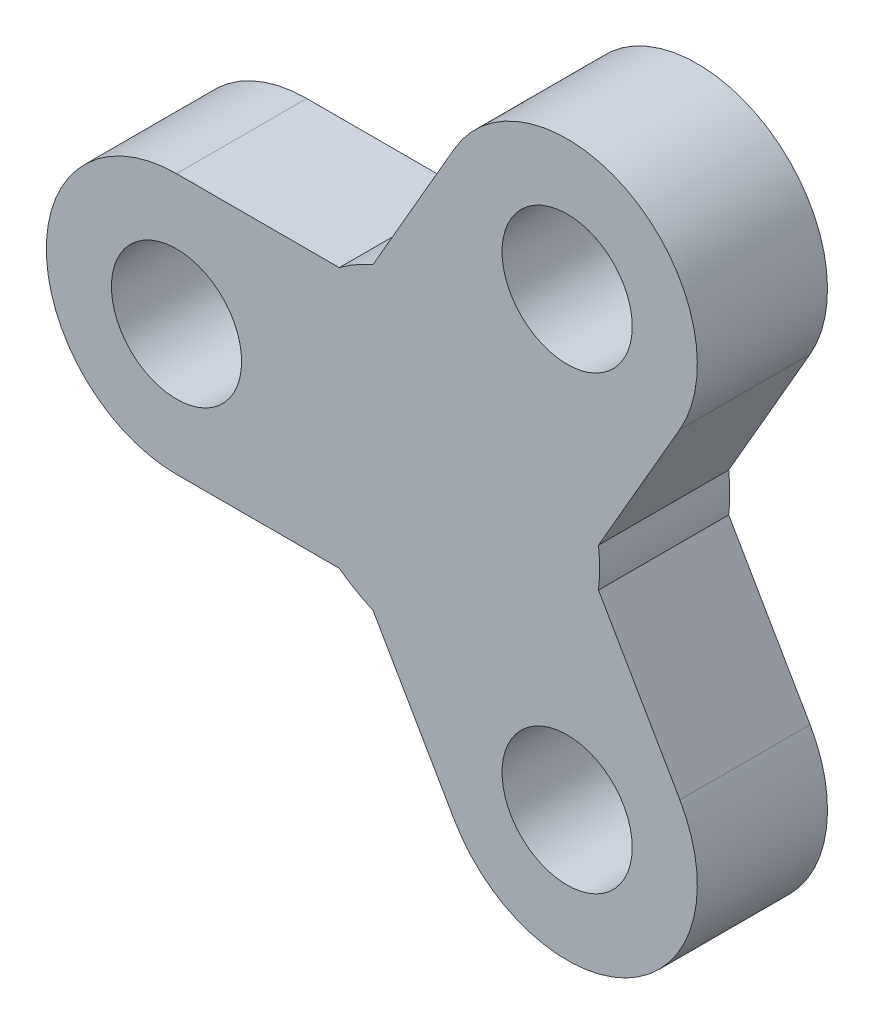
ISO-10303-21;
HEADER;
FILE_DESCRIPTION(('STEP AP214'),'2;1');
FILE_NAME('part.step','',(''),(''),'','','');
FILE_SCHEMA(('AUTOMOTIVE_DESIGN { 1 0 10303 214 1 1 1 1 }'));
ENDSEC;
DATA;
#1=APPLICATION_CONTEXT('core data for automotive mechanical design processes');
#2=APPLICATION_PROTOCOL_DEFINITION('international standard','automotive_design',2000,#1);
#3=PRODUCT_CONTEXT('',#1,'mechanical');
#4=PRODUCT('Part','Part','',(#3));
#5=PRODUCT_RELATED_PRODUCT_CATEGORY('part','',(#4));
#6=PRODUCT_DEFINITION_FORMATION('','',#4);
#7=PRODUCT_DEFINITION_CONTEXT('part definition',#1,'design');
#8=PRODUCT_DEFINITION('design','',#6,#7);
#9=PRODUCT_DEFINITION_SHAPE('','',#8);
#10=(LENGTH_UNIT() NAMED_UNIT(*) SI_UNIT(.MILLI.,.METRE.));
#11=(NAMED_UNIT(*) PLANE_ANGLE_UNIT() SI_UNIT($,.RADIAN.));
#12=(NAMED_UNIT(*) SI_UNIT($,.STERADIAN.) SOLID_ANGLE_UNIT());
#13=UNCERTAINTY_MEASURE_WITH_UNIT(LENGTH_MEASURE(1.E-05),#10,'distance_accuracy_value','');
#14=(GEOMETRIC_REPRESENTATION_CONTEXT(3) GLOBAL_UNCERTAINTY_ASSIGNED_CONTEXT((#13)) GLOBAL_UNIT_ASSIGNED_CONTEXT((#10,
#11,#12)) REPRESENTATION_CONTEXT('',''));
#15=CARTESIAN_POINT('',(0.,0.,0.));
#16=DIRECTION('',(0.,0.,1.));
#17=DIRECTION('',(1.,0.,0.));
#18=AXIS2_PLACEMENT_3D('',#15,#16,#17);
#19=CARTESIAN_POINT('',(-20.,0.,10.));
#20=DIRECTION('',(0.,0.,1.));
#21=DIRECTION('',(1.,0.,0.));
#22=AXIS2_PLACEMENT_3D('',#19,#20,#21);
#23=PLANE('',#22);
#24=CARTESIAN_POINT('',(10.,17.3205080756888,10.));
#25=DIRECTION('',(0.,0.,1.));
#26=DIRECTION('',(1.,0.,0.));
#27=AXIS2_PLACEMENT_3D('',#24,#25,#26);
#28=CIRCLE('',#27,5.);
#29=CARTESIAN_POINT('',(15.,17.3205080756888,10.));
#30=VERTEX_POINT('',#29);
#31=EDGE_CURVE('E289',#30,#30,#28,.T.);
#32=ORIENTED_EDGE('',*,*,#31,.F.);
#33=EDGE_LOOP('',(#32));
#34=FACE_BOUND('',#33,.T.);
#35=CARTESIAN_POINT('',(-20.,0.,10.));
#36=DIRECTION('',(0.,0.,1.));
#37=DIRECTION('',(1.,0.,0.));
#38=AXIS2_PLACEMENT_3D('',#35,#36,#37);
#39=CIRCLE('',#38,10.);
#40=CARTESIAN_POINT('',(-20.,10.,10.));
#41=VERTEX_POINT('',#40);
#42=CARTESIAN_POINT('',(-20.,-10.,10.));
#43=VERTEX_POINT('',#42);
#44=EDGE_CURVE('E180',#41,#43,#39,.T.);
#45=ORIENTED_EDGE('',*,*,#44,.T.);
#46=DIRECTION('',(1.,0.,0.));
#47=VECTOR('',#46,1.);
#48=CARTESIAN_POINT('',(-20.,-10.,10.));
#49=LINE('',#48,#47);
#50=CARTESIAN_POINT('',(-7.5,-10.,10.));
#51=VERTEX_POINT('',#50);
#52=EDGE_CURVE('E108',#43,#51,#49,.T.);
#53=ORIENTED_EDGE('',*,*,#52,.T.);
#54=CARTESIAN_POINT('',(2.63677968348475E-13,4.54497550705923E-13,10.));
#55=DIRECTION('',(0.,0.,1.));
#56=DIRECTION('',(1.,0.,0.));
#57=AXIS2_PLACEMENT_3D('',#54,#55,#56);
#58=CIRCLE('',#57,12.5000000000005);
#59=CARTESIAN_POINT('',(-4.91025403784438,-11.4951905283833,10.));
#60=VERTEX_POINT('',#59);
#61=EDGE_CURVE('E207',#51,#60,#58,.T.);
#62=ORIENTED_EDGE('',*,*,#61,.T.);
#63=DIRECTION('',(0.500000000000001,-0.866025403784438,0.));
#64=VECTOR('',#63,1.);
#65=CARTESIAN_POINT('',(1.33974596215562,-22.3205080756888,10.));
#66=LINE('',#65,#64);
#67=CARTESIAN_POINT('',(1.33974596215561,-22.3205080756888,10.));
#68=VERTEX_POINT('',#67);
#69=EDGE_CURVE('E226',#60,#68,#66,.T.);
#70=ORIENTED_EDGE('',*,*,#69,.T.);
#71=CARTESIAN_POINT('',(9.99999999999999,-17.3205080756888,10.));
#72=DIRECTION('',(0.,0.,1.));
#73=DIRECTION('',(1.,0.,0.));
#74=AXIS2_PLACEMENT_3D('',#71,#72,#73);
#75=CIRCLE('',#74,10.);
#76=CARTESIAN_POINT('',(18.6602540378444,-12.3205080756888,10.));
#77=VERTEX_POINT('',#76);
#78=EDGE_CURVE('E223',#68,#77,#75,.T.);
#79=ORIENTED_EDGE('',*,*,#78,.T.);
#80=DIRECTION('',(-0.500000000000001,0.866025403784438,0.));
#81=VECTOR('',#80,1.);
#82=CARTESIAN_POINT('',(18.6602540378444,-12.3205080756888,10.));
#83=LINE('',#82,#81);
#84=CARTESIAN_POINT('',(12.4102540378444,-1.49519052838328,10.));
#85=VERTEX_POINT('',#84);
#86=EDGE_CURVE('E225',#77,#85,#83,.T.);
#87=ORIENTED_EDGE('',*,*,#86,.T.);
#88=CARTESIAN_POINT('',(-1.58998502731988E-06,0.,10.));
#89=DIRECTION('',(0.,0.,1.));
#90=DIRECTION('',(-1.,0.,0.));
#91=AXIS2_PLACEMENT_3D('',#88,#89,#90);
#92=CIRCLE('',#91,12.5000015785694);
#93=CARTESIAN_POINT('',(12.4102540378444,1.49519052838329,10.));
#94=VERTEX_POINT('',#93);
#95=EDGE_CURVE('E228',#85,#94,#92,.T.);
#96=ORIENTED_EDGE('',*,*,#95,.T.);
#97=DIRECTION('',(0.5,0.866025403784439,0.));
#98=VECTOR('',#97,1.);
#99=CARTESIAN_POINT('',(18.6602540378444,12.3205080756888,10.));
#100=LINE('',#99,#98);
#101=CARTESIAN_POINT('',(18.6602540378444,12.3205080756888,10.));
#102=VERTEX_POINT('',#101);
#103=EDGE_CURVE('E234',#94,#102,#100,.T.);
#104=ORIENTED_EDGE('',*,*,#103,.T.);
#105=CARTESIAN_POINT('',(10.,17.3205080756888,10.));
#106=DIRECTION('',(0.,0.,1.));
#107=DIRECTION('',(1.,0.,0.));
#108=AXIS2_PLACEMENT_3D('',#105,#106,#107);
#109=CIRCLE('',#108,10.);
#110=CARTESIAN_POINT('',(1.33974596215561,22.3205080756888,10.));
#111=VERTEX_POINT('',#110);
#112=EDGE_CURVE('E139',#102,#111,#109,.T.);
#113=ORIENTED_EDGE('',*,*,#112,.T.);
#114=DIRECTION('',(-0.5,-0.866025403784439,0.));
#115=VECTOR('',#114,1.);
#116=CARTESIAN_POINT('',(1.33974596215561,22.3205080756888,10.));
#117=LINE('',#116,#115);
#118=CARTESIAN_POINT('',(-4.91025403784439,11.4951905283833,10.));
#119=VERTEX_POINT('',#118);
#120=EDGE_CURVE('E133',#111,#119,#117,.T.);
#121=ORIENTED_EDGE('',*,*,#120,.T.);
#122=CARTESIAN_POINT('',(0.,0.,10.));
#123=DIRECTION('',(0.,0.,1.));
#124=DIRECTION('',(-1.,0.,0.));
#125=AXIS2_PLACEMENT_3D('',#122,#123,#124);
#126=CIRCLE('',#125,12.5);
#127=CARTESIAN_POINT('',(-7.5,10.,10.));
#128=VERTEX_POINT('',#127);
#129=EDGE_CURVE('E137',#119,#128,#126,.T.);
#130=ORIENTED_EDGE('',*,*,#129,.T.);
#131=DIRECTION('',(-1.,0.,0.));
#132=VECTOR('',#131,1.);
#133=CARTESIAN_POINT('',(-20.,10.,10.));
#134=LINE('',#133,#132);
#135=EDGE_CURVE('E53',#128,#41,#134,.T.);
#136=ORIENTED_EDGE('',*,*,#135,.T.);
#137=EDGE_LOOP('',(#45,#53,#62,#70,#79,#87,#96,#104,#113,#121,#130,#136));
#138=FACE_BOUND('',#137,.T.);
#139=CARTESIAN_POINT('',(-20.,0.,10.));
#140=DIRECTION('',(0.,0.,1.));
#141=DIRECTION('',(1.,0.,0.));
#142=AXIS2_PLACEMENT_3D('',#139,#140,#141);
#143=CIRCLE('',#142,5.);
#144=CARTESIAN_POINT('',(-15.,0.,10.));
#145=VERTEX_POINT('',#144);
#146=EDGE_CURVE('E161',#145,#145,#143,.T.);
#147=ORIENTED_EDGE('',*,*,#146,.F.);
#148=EDGE_LOOP('',(#147));
#149=FACE_BOUND('',#148,.T.);
#150=CARTESIAN_POINT('',(9.99999999999999,-17.3205080756888,10.));
#151=DIRECTION('',(0.,0.,1.));
#152=DIRECTION('',(1.,0.,0.));
#153=AXIS2_PLACEMENT_3D('',#150,#151,#152);
#154=CIRCLE('',#153,5.);
#155=CARTESIAN_POINT('',(15.,-17.3205080756888,10.));
#156=VERTEX_POINT('',#155);
#157=EDGE_CURVE('E280',#156,#156,#154,.T.);
#158=ORIENTED_EDGE('',*,*,#157,.F.);
#159=EDGE_LOOP('',(#158));
#160=FACE_BOUND('',#159,.T.);
#161=ADVANCED_FACE('F36',(#34,#138,#149,#160),#23,.T.);
#162=CARTESIAN_POINT('',(-20.,0.,0.));
#163=DIRECTION('',(0.,0.,1.));
#164=DIRECTION('',(1.,0.,0.));
#165=AXIS2_PLACEMENT_3D('',#162,#163,#164);
#166=PLANE('',#165);
#167=CARTESIAN_POINT('',(-20.,0.,0.));
#168=DIRECTION('',(0.,0.,1.));
#169=DIRECTION('',(1.,0.,0.));
#170=AXIS2_PLACEMENT_3D('',#167,#168,#169);
#171=CIRCLE('',#170,10.);
#172=CARTESIAN_POINT('',(-20.,10.,0.));
#173=VERTEX_POINT('',#172);
#174=CARTESIAN_POINT('',(-20.,-10.,0.));
#175=VERTEX_POINT('',#174);
#176=EDGE_CURVE('E157',#173,#175,#171,.T.);
#177=ORIENTED_EDGE('',*,*,#176,.F.);
#178=DIRECTION('',(-1.,0.,0.));
#179=VECTOR('',#178,1.);
#180=CARTESIAN_POINT('',(-20.,10.,0.));
#181=LINE('',#180,#179);
#182=CARTESIAN_POINT('',(-7.5,10.,0.));
#183=VERTEX_POINT('',#182);
#184=EDGE_CURVE('E100',#183,#173,#181,.T.);
#185=ORIENTED_EDGE('',*,*,#184,.F.);
#186=CARTESIAN_POINT('',(0.,0.,0.));
#187=DIRECTION('',(0.,0.,1.));
#188=DIRECTION('',(-1.,0.,0.));
#189=AXIS2_PLACEMENT_3D('',#186,#187,#188);
#190=CIRCLE('',#189,12.5);
#191=CARTESIAN_POINT('',(-4.91025403784439,11.4951905283833,0.));
#192=VERTEX_POINT('',#191);
#193=EDGE_CURVE('E94',#192,#183,#190,.T.);
#194=ORIENTED_EDGE('',*,*,#193,.F.);
#195=DIRECTION('',(-0.5,-0.866025403784439,0.));
#196=VECTOR('',#195,1.);
#197=CARTESIAN_POINT('',(1.33974596215561,22.3205080756888,0.));
#198=LINE('',#197,#196);
#199=CARTESIAN_POINT('',(1.33974596215561,22.3205080756888,0.));
#200=VERTEX_POINT('',#199);
#201=EDGE_CURVE('E147',#200,#192,#198,.T.);
#202=ORIENTED_EDGE('',*,*,#201,.F.);
#203=CARTESIAN_POINT('',(10.,17.3205080756888,0.));
#204=DIRECTION('',(0.,0.,1.));
#205=DIRECTION('',(1.,0.,0.));
#206=AXIS2_PLACEMENT_3D('',#203,#204,#205);
#207=CIRCLE('',#206,10.);
#208=CARTESIAN_POINT('',(18.6602540378444,12.3205080756888,0.));
#209=VERTEX_POINT('',#208);
#210=EDGE_CURVE('E175',#209,#200,#207,.T.);
#211=ORIENTED_EDGE('',*,*,#210,.F.);
#212=DIRECTION('',(0.5,0.866025403784439,0.));
#213=VECTOR('',#212,1.);
#214=CARTESIAN_POINT('',(18.6602540378444,12.3205080756888,0.));
#215=LINE('',#214,#213);
#216=CARTESIAN_POINT('',(12.4102540378444,1.49519052838329,0.));
#217=VERTEX_POINT('',#216);
#218=EDGE_CURVE('E173',#217,#209,#215,.T.);
#219=ORIENTED_EDGE('',*,*,#218,.F.);
#220=CARTESIAN_POINT('',(-1.58998502731988E-06,0.,0.));
#221=DIRECTION('',(0.,0.,1.));
#222=DIRECTION('',(-1.,0.,0.));
#223=AXIS2_PLACEMENT_3D('',#220,#221,#222);
#224=CIRCLE('',#223,12.5000015785694);
#225=CARTESIAN_POINT('',(12.4102540378444,-1.49519052838328,0.));
#226=VERTEX_POINT('',#225);
#227=EDGE_CURVE('E171',#226,#217,#224,.T.);
#228=ORIENTED_EDGE('',*,*,#227,.F.);
#229=DIRECTION('',(-0.500000000000001,0.866025403784438,0.));
#230=VECTOR('',#229,1.);
#231=CARTESIAN_POINT('',(18.6602540378444,-12.3205080756888,0.));
#232=LINE('',#231,#230);
#233=CARTESIAN_POINT('',(18.6602540378444,-12.3205080756888,0.));
#234=VERTEX_POINT('',#233);
#235=EDGE_CURVE('E169',#234,#226,#232,.T.);
#236=ORIENTED_EDGE('',*,*,#235,.F.);
#237=CARTESIAN_POINT('',(9.99999999999999,-17.3205080756888,0.));
#238=DIRECTION('',(0.,0.,1.));
#239=DIRECTION('',(1.,0.,0.));
#240=AXIS2_PLACEMENT_3D('',#237,#238,#239);
#241=CIRCLE('',#240,10.);
#242=CARTESIAN_POINT('',(1.33974596215561,-22.3205080756888,0.));
#243=VERTEX_POINT('',#242);
#244=EDGE_CURVE('E167',#243,#234,#241,.T.);
#245=ORIENTED_EDGE('',*,*,#244,.F.);
#246=DIRECTION('',(0.500000000000001,-0.866025403784438,0.));
#247=VECTOR('',#246,1.);
#248=CARTESIAN_POINT('',(1.33974596215562,-22.3205080756888,0.));
#249=LINE('',#248,#247);
#250=CARTESIAN_POINT('',(-4.91025403784438,-11.4951905283833,0.));
#251=VERTEX_POINT('',#250);
#252=EDGE_CURVE('E165',#251,#243,#249,.T.);
#253=ORIENTED_EDGE('',*,*,#252,.F.);
#254=CARTESIAN_POINT('',(2.63677968348475E-13,4.54497550705923E-13,0.));
#255=DIRECTION('',(0.,0.,1.));
#256=DIRECTION('',(1.,0.,0.));
#257=AXIS2_PLACEMENT_3D('',#254,#255,#256);
#258=CIRCLE('',#257,12.5000000000005);
#259=CARTESIAN_POINT('',(-7.5,-10.,0.));
#260=VERTEX_POINT('',#259);
#261=EDGE_CURVE('E163',#260,#251,#258,.T.);
#262=ORIENTED_EDGE('',*,*,#261,.F.);
#263=DIRECTION('',(1.,0.,0.));
#264=VECTOR('',#263,1.);
#265=CARTESIAN_POINT('',(-20.,-10.,0.));
#266=LINE('',#265,#264);
#267=EDGE_CURVE('E160',#175,#260,#266,.T.);
#268=ORIENTED_EDGE('',*,*,#267,.F.);
#269=EDGE_LOOP('',(#177,#185,#194,#202,#211,#219,#228,#236,#245,#253,#262,#268));
#270=FACE_BOUND('',#269,.T.);
#271=CARTESIAN_POINT('',(-20.,0.,0.));
#272=DIRECTION('',(0.,0.,1.));
#273=DIRECTION('',(1.,0.,0.));
#274=AXIS2_PLACEMENT_3D('',#271,#272,#273);
#275=CIRCLE('',#274,5.);
#276=CARTESIAN_POINT('',(-15.,0.,0.));
#277=VERTEX_POINT('',#276);
#278=EDGE_CURVE('E292',#277,#277,#275,.T.);
#279=ORIENTED_EDGE('',*,*,#278,.T.);
#280=EDGE_LOOP('',(#279));
#281=FACE_BOUND('',#280,.T.);
#282=CARTESIAN_POINT('',(10.,17.3205080756888,0.));
#283=DIRECTION('',(0.,0.,1.));
#284=DIRECTION('',(1.,0.,0.));
#285=AXIS2_PLACEMENT_3D('',#282,#283,#284);
#286=CIRCLE('',#285,5.);
#287=CARTESIAN_POINT('',(15.,17.3205080756888,0.));
#288=VERTEX_POINT('',#287);
#289=EDGE_CURVE('E286',#288,#288,#286,.T.);
#290=ORIENTED_EDGE('',*,*,#289,.T.);
#291=EDGE_LOOP('',(#290));
#292=FACE_BOUND('',#291,.T.);
#293=CARTESIAN_POINT('',(9.99999999999999,-17.3205080756888,0.));
#294=DIRECTION('',(0.,0.,1.));
#295=DIRECTION('',(1.,0.,0.));
#296=AXIS2_PLACEMENT_3D('',#293,#294,#295);
#297=CIRCLE('',#296,5.);
#298=CARTESIAN_POINT('',(15.,-17.3205080756888,0.));
#299=VERTEX_POINT('',#298);
#300=EDGE_CURVE('E283',#299,#299,#297,.T.);
#301=ORIENTED_EDGE('',*,*,#300,.T.);
#302=EDGE_LOOP('',(#301));
#303=FACE_BOUND('',#302,.T.);
#304=ADVANCED_FACE('F211',(#270,#281,#292,#303),#166,.F.);
#305=CARTESIAN_POINT('',(-20.,0.,10.));
#306=DIRECTION('',(0.,0.,-1.));
#307=DIRECTION('',(-1.,0.,0.));
#308=AXIS2_PLACEMENT_3D('',#305,#306,#307);
#309=CYLINDRICAL_SURFACE('',#308,10.);
#310=ORIENTED_EDGE('',*,*,#176,.T.);
#311=DIRECTION('',(0.,0.,-1.));
#312=VECTOR('',#311,1.);
#313=CARTESIAN_POINT('',(-20.,-10.,10.));
#314=LINE('',#313,#312);
#315=EDGE_CURVE('E11',#43,#175,#314,.T.);
#316=ORIENTED_EDGE('',*,*,#315,.F.);
#317=ORIENTED_EDGE('',*,*,#44,.F.);
#318=DIRECTION('',(0.,0.,-1.));
#319=VECTOR('',#318,1.);
#320=CARTESIAN_POINT('',(-20.,10.,10.));
#321=LINE('',#320,#319);
#322=EDGE_CURVE('E153',#41,#173,#321,.T.);
#323=ORIENTED_EDGE('',*,*,#322,.T.);
#324=EDGE_LOOP('',(#310,#316,#317,#323));
#325=FACE_BOUND('',#324,.T.);
#326=ADVANCED_FACE('F38',(#325),#309,.T.);
#327=CARTESIAN_POINT('',(-20.,-10.,10.));
#328=DIRECTION('',(0.,1.,0.));
#329=DIRECTION('',(0.,0.,1.));
#330=AXIS2_PLACEMENT_3D('',#327,#328,#329);
#331=PLANE('',#330);
#332=ORIENTED_EDGE('',*,*,#267,.T.);
#333=DIRECTION('',(0.,0.,-1.));
#334=VECTOR('',#333,1.);
#335=CARTESIAN_POINT('',(-7.5,-10.,10.));
#336=LINE('',#335,#334);
#337=EDGE_CURVE('E45',#51,#260,#336,.T.);
#338=ORIENTED_EDGE('',*,*,#337,.F.);
#339=ORIENTED_EDGE('',*,*,#52,.F.);
#340=ORIENTED_EDGE('',*,*,#315,.T.);
#341=EDGE_LOOP('',(#332,#338,#339,#340));
#342=FACE_BOUND('',#341,.T.);
#343=ADVANCED_FACE('F394',(#342),#331,.F.);
#344=CARTESIAN_POINT('',(2.63677968348475E-13,4.54497550705923E-13,10.));
#345=DIRECTION('',(0.,0.,-1.));
#346=DIRECTION('',(-1.,0.,0.));
#347=AXIS2_PLACEMENT_3D('',#344,#345,#346);
#348=CYLINDRICAL_SURFACE('',#347,12.5000000000005);
#349=ORIENTED_EDGE('',*,*,#261,.T.);
#350=DIRECTION('',(0.,0.,-1.));
#351=VECTOR('',#350,1.);
#352=CARTESIAN_POINT('',(-4.91025403784438,-11.4951905283833,10.));
#353=LINE('',#352,#351);
#354=EDGE_CURVE('E199',#60,#251,#353,.T.);
#355=ORIENTED_EDGE('',*,*,#354,.F.);
#356=ORIENTED_EDGE('',*,*,#61,.F.);
#357=ORIENTED_EDGE('',*,*,#337,.T.);
#358=EDGE_LOOP('',(#349,#355,#356,#357));
#359=FACE_BOUND('',#358,.T.);
#360=ADVANCED_FACE('F205',(#359),#348,.T.);
#361=CARTESIAN_POINT('',(1.33974596215562,-22.3205080756888,10.));
#362=DIRECTION('',(0.866025403784438,0.500000000000001,0.));
#363=DIRECTION('',(-0.500000000000001,0.866025403784438,0.));
#364=AXIS2_PLACEMENT_3D('',#361,#362,#363);
#365=PLANE('',#364);
#366=ORIENTED_EDGE('',*,*,#252,.T.);
#367=DIRECTION('',(0.,0.,-1.));
#368=VECTOR('',#367,1.);
#369=CARTESIAN_POINT('',(1.33974596215561,-22.3205080756888,10.));
#370=LINE('',#369,#368);
#371=EDGE_CURVE('E196',#68,#243,#370,.T.);
#372=ORIENTED_EDGE('',*,*,#371,.F.);
#373=ORIENTED_EDGE('',*,*,#69,.F.);
#374=ORIENTED_EDGE('',*,*,#354,.T.);
#375=EDGE_LOOP('',(#366,#372,#373,#374));
#376=FACE_BOUND('',#375,.T.);
#377=ADVANCED_FACE('F217',(#376),#365,.F.);
#378=CARTESIAN_POINT('',(9.99999999999999,-17.3205080756888,10.));
#379=DIRECTION('',(0.,0.,-1.));
#380=DIRECTION('',(-1.,0.,0.));
#381=AXIS2_PLACEMENT_3D('',#378,#379,#380);
#382=CYLINDRICAL_SURFACE('',#381,10.);
#383=ORIENTED_EDGE('',*,*,#244,.T.);
#384=DIRECTION('',(0.,0.,-1.));
#385=VECTOR('',#384,1.);
#386=CARTESIAN_POINT('',(18.6602540378444,-12.3205080756888,10.));
#387=LINE('',#386,#385);
#388=EDGE_CURVE('E193',#77,#234,#387,.T.);
#389=ORIENTED_EDGE('',*,*,#388,.F.);
#390=ORIENTED_EDGE('',*,*,#78,.F.);
#391=ORIENTED_EDGE('',*,*,#371,.T.);
#392=EDGE_LOOP('',(#383,#389,#390,#391));
#393=FACE_BOUND('',#392,.T.);
#394=ADVANCED_FACE('F221',(#393),#382,.T.);
#395=CARTESIAN_POINT('',(18.6602540378444,-12.3205080756888,10.));
#396=DIRECTION('',(-0.866025403784438,-0.500000000000001,0.));
#397=DIRECTION('',(0.500000000000001,-0.866025403784438,0.));
#398=AXIS2_PLACEMENT_3D('',#395,#396,#397);
#399=PLANE('',#398);
#400=ORIENTED_EDGE('',*,*,#235,.T.);
#401=DIRECTION('',(0.,0.,-1.));
#402=VECTOR('',#401,1.);
#403=CARTESIAN_POINT('',(12.4102540378444,-1.49519052838328,10.));
#404=LINE('',#403,#402);
#405=EDGE_CURVE('E190',#85,#226,#404,.T.);
#406=ORIENTED_EDGE('',*,*,#405,.F.);
#407=ORIENTED_EDGE('',*,*,#86,.F.);
#408=ORIENTED_EDGE('',*,*,#388,.T.);
#409=EDGE_LOOP('',(#400,#406,#407,#408));
#410=FACE_BOUND('',#409,.T.);
#411=ADVANCED_FACE('F359',(#410),#399,.F.);
#412=CARTESIAN_POINT('',(-1.58998502731988E-06,0.,10.));
#413=DIRECTION('',(0.,0.,-1.));
#414=DIRECTION('',(-1.,0.,0.));
#415=AXIS2_PLACEMENT_3D('',#412,#413,#414);
#416=CYLINDRICAL_SURFACE('',#415,12.5000015785694);
#417=ORIENTED_EDGE('',*,*,#227,.T.);
#418=DIRECTION('',(0.,0.,-1.));
#419=VECTOR('',#418,1.);
#420=CARTESIAN_POINT('',(12.4102540378444,1.49519052838329,10.));
#421=LINE('',#420,#419);
#422=EDGE_CURVE('E187',#94,#217,#421,.T.);
#423=ORIENTED_EDGE('',*,*,#422,.F.);
#424=ORIENTED_EDGE('',*,*,#95,.F.);
#425=ORIENTED_EDGE('',*,*,#405,.T.);
#426=EDGE_LOOP('',(#417,#423,#424,#425));
#427=FACE_BOUND('',#426,.T.);
#428=ADVANCED_FACE('F350',(#427),#416,.T.);
#429=CARTESIAN_POINT('',(18.6602540378444,12.3205080756888,10.));
#430=DIRECTION('',(-0.866025403784439,0.5,0.));
#431=DIRECTION('',(-0.5,-0.866025403784439,0.));
#432=AXIS2_PLACEMENT_3D('',#429,#430,#431);
#433=PLANE('',#432);
#434=ORIENTED_EDGE('',*,*,#218,.T.);
#435=DIRECTION('',(0.,0.,-1.));
#436=VECTOR('',#435,1.);
#437=CARTESIAN_POINT('',(18.6602540378444,12.3205080756888,10.));
#438=LINE('',#437,#436);
#439=EDGE_CURVE('E184',#102,#209,#438,.T.);
#440=ORIENTED_EDGE('',*,*,#439,.F.);
#441=ORIENTED_EDGE('',*,*,#103,.F.);
#442=ORIENTED_EDGE('',*,*,#422,.T.);
#443=EDGE_LOOP('',(#434,#440,#441,#442));
#444=FACE_BOUND('',#443,.T.);
#445=ADVANCED_FACE('F240',(#444),#433,.F.);
#446=CARTESIAN_POINT('',(10.,17.3205080756888,10.));
#447=DIRECTION('',(0.,0.,-1.));
#448=DIRECTION('',(-1.,0.,0.));
#449=AXIS2_PLACEMENT_3D('',#446,#447,#448);
#450=CYLINDRICAL_SURFACE('',#449,10.);
#451=ORIENTED_EDGE('',*,*,#210,.T.);
#452=DIRECTION('',(0.,0.,-1.));
#453=VECTOR('',#452,1.);
#454=CARTESIAN_POINT('',(1.33974596215561,22.3205080756888,10.));
#455=LINE('',#454,#453);
#456=EDGE_CURVE('E148',#111,#200,#455,.T.);
#457=ORIENTED_EDGE('',*,*,#456,.F.);
#458=ORIENTED_EDGE('',*,*,#112,.F.);
#459=ORIENTED_EDGE('',*,*,#439,.T.);
#460=EDGE_LOOP('',(#451,#457,#458,#459));
#461=FACE_BOUND('',#460,.T.);
#462=ADVANCED_FACE('F244',(#461),#450,.T.);
#463=CARTESIAN_POINT('',(1.33974596215561,22.3205080756888,10.));
#464=DIRECTION('',(0.866025403784439,-0.5,0.));
#465=DIRECTION('',(0.5,0.866025403784439,0.));
#466=AXIS2_PLACEMENT_3D('',#463,#464,#465);
#467=PLANE('',#466);
#468=ORIENTED_EDGE('',*,*,#201,.T.);
#469=DIRECTION('',(0.,0.,-1.));
#470=VECTOR('',#469,1.);
#471=CARTESIAN_POINT('',(-4.91025403784439,11.4951905283833,10.));
#472=LINE('',#471,#470);
#473=EDGE_CURVE('E144',#119,#192,#472,.T.);
#474=ORIENTED_EDGE('',*,*,#473,.F.);
#475=ORIENTED_EDGE('',*,*,#120,.F.);
#476=ORIENTED_EDGE('',*,*,#456,.T.);
#477=EDGE_LOOP('',(#468,#474,#475,#476));
#478=FACE_BOUND('',#477,.T.);
#479=ADVANCED_FACE('F145',(#478),#467,.F.);
#480=CARTESIAN_POINT('',(0.,0.,10.));
#481=DIRECTION('',(0.,0.,-1.));
#482=DIRECTION('',(-1.,0.,0.));
#483=AXIS2_PLACEMENT_3D('',#480,#481,#482);
#484=CYLINDRICAL_SURFACE('',#483,12.5);
#485=ORIENTED_EDGE('',*,*,#193,.T.);
#486=DIRECTION('',(0.,0.,-1.));
#487=VECTOR('',#486,1.);
#488=CARTESIAN_POINT('',(-7.5,10.,10.));
#489=LINE('',#488,#487);
#490=EDGE_CURVE('E149',#128,#183,#489,.T.);
#491=ORIENTED_EDGE('',*,*,#490,.F.);
#492=ORIENTED_EDGE('',*,*,#129,.F.);
#493=ORIENTED_EDGE('',*,*,#473,.T.);
#494=EDGE_LOOP('',(#485,#491,#492,#493));
#495=FACE_BOUND('',#494,.T.);
#496=ADVANCED_FACE('F151',(#495),#484,.T.);
#497=CARTESIAN_POINT('',(-20.,10.,10.));
#498=DIRECTION('',(0.,-1.,0.));
#499=DIRECTION('',(0.,0.,-1.));
#500=AXIS2_PLACEMENT_3D('',#497,#498,#499);
#501=PLANE('',#500);
#502=ORIENTED_EDGE('',*,*,#184,.T.);
#503=ORIENTED_EDGE('',*,*,#322,.F.);
#504=ORIENTED_EDGE('',*,*,#135,.F.);
#505=ORIENTED_EDGE('',*,*,#490,.T.);
#506=EDGE_LOOP('',(#502,#503,#504,#505));
#507=FACE_BOUND('',#506,.T.);
#508=ADVANCED_FACE('F248',(#507),#501,.F.);
#509=CARTESIAN_POINT('',(-20.,0.,10.));
#510=DIRECTION('',(0.,0.,-1.));
#511=DIRECTION('',(-1.,0.,0.));
#512=AXIS2_PLACEMENT_3D('',#509,#510,#511);
#513=CYLINDRICAL_SURFACE('',#512,5.);
#514=ORIENTED_EDGE('',*,*,#146,.T.);
#515=EDGE_LOOP('',(#514));
#516=FACE_BOUND('',#515,.T.);
#517=ORIENTED_EDGE('',*,*,#278,.F.);
#518=EDGE_LOOP('',(#517));
#519=FACE_BOUND('',#518,.T.);
#520=ADVANCED_FACE('F250',(#516,#519),#513,.F.);
#521=CARTESIAN_POINT('',(10.,17.3205080756888,10.));
#522=DIRECTION('',(0.,0.,-1.));
#523=DIRECTION('',(-1.,0.,0.));
#524=AXIS2_PLACEMENT_3D('',#521,#522,#523);
#525=CYLINDRICAL_SURFACE('',#524,5.);
#526=ORIENTED_EDGE('',*,*,#31,.T.);
#527=EDGE_LOOP('',(#526));
#528=FACE_BOUND('',#527,.T.);
#529=ORIENTED_EDGE('',*,*,#289,.F.);
#530=EDGE_LOOP('',(#529));
#531=FACE_BOUND('',#530,.T.);
#532=ADVANCED_FACE('F256',(#528,#531),#525,.F.);
#533=CARTESIAN_POINT('',(9.99999999999999,-17.3205080756888,10.));
#534=DIRECTION('',(0.,0.,-1.));
#535=DIRECTION('',(-1.,0.,0.));
#536=AXIS2_PLACEMENT_3D('',#533,#534,#535);
#537=CYLINDRICAL_SURFACE('',#536,5.);
#538=ORIENTED_EDGE('',*,*,#157,.T.);
#539=EDGE_LOOP('',(#538));
#540=FACE_BOUND('',#539,.T.);
#541=ORIENTED_EDGE('',*,*,#300,.F.);
#542=EDGE_LOOP('',(#541));
#543=FACE_BOUND('',#542,.T.);
#544=ADVANCED_FACE('F271',(#540,#543),#537,.F.);
#545=CLOSED_SHELL('',(#161,#304,#326,#343,#360,#377,#394,#411,#428,#445,#462,#479,#496,#508,
#520,#532,#544));
#546=MANIFOLD_SOLID_BREP('B2',#545);
#547=ADVANCED_BREP_SHAPE_REPRESENTATION('',(#18,#546),#14);
#548=SHAPE_DEFINITION_REPRESENTATION(#9,#547);
ENDSEC;
END-ISO-10303-21;
